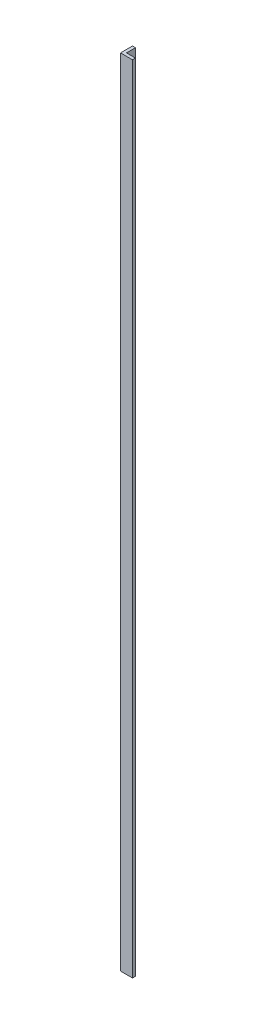
ISO-10303-21;
HEADER;
FILE_DESCRIPTION(('STEP AP214'),'2;1');
FILE_NAME('part.step','',(''),(''),'','','');
FILE_SCHEMA(('AUTOMOTIVE_DESIGN { 1 0 10303 214 1 1 1 1 }'));
ENDSEC;
DATA;
#1=APPLICATION_CONTEXT('core data for automotive mechanical design processes');
#2=APPLICATION_PROTOCOL_DEFINITION('international standard','automotive_design',2000,#1);
#3=PRODUCT_CONTEXT('',#1,'mechanical');
#4=PRODUCT('Part','Part','',(#3));
#5=PRODUCT_RELATED_PRODUCT_CATEGORY('part','',(#4));
#6=PRODUCT_DEFINITION_FORMATION('','',#4);
#7=PRODUCT_DEFINITION_CONTEXT('part definition',#1,'design');
#8=PRODUCT_DEFINITION('design','',#6,#7);
#9=PRODUCT_DEFINITION_SHAPE('','',#8);
#10=(LENGTH_UNIT() NAMED_UNIT(*) SI_UNIT(.MILLI.,.METRE.));
#11=(NAMED_UNIT(*) PLANE_ANGLE_UNIT() SI_UNIT($,.RADIAN.));
#12=(NAMED_UNIT(*) SI_UNIT($,.STERADIAN.) SOLID_ANGLE_UNIT());
#13=UNCERTAINTY_MEASURE_WITH_UNIT(LENGTH_MEASURE(1.E-05),#10,'distance_accuracy_value','');
#14=(GEOMETRIC_REPRESENTATION_CONTEXT(3) GLOBAL_UNCERTAINTY_ASSIGNED_CONTEXT((#13)) GLOBAL_UNIT_ASSIGNED_CONTEXT((#10,
#11,#12)) REPRESENTATION_CONTEXT('',''));
#15=CARTESIAN_POINT('',(0.,0.,0.));
#16=DIRECTION('',(0.,0.,1.));
#17=DIRECTION('',(1.,0.,0.));
#18=AXIS2_PLACEMENT_3D('',#15,#16,#17);
#19=CARTESIAN_POINT('',(0.,423.545,0.));
#20=DIRECTION('',(1.,0.,0.));
#21=DIRECTION('',(0.,0.,-1.));
#22=AXIS2_PLACEMENT_3D('',#19,#20,#21);
#23=PLANE('',#22);
#24=DIRECTION('',(0.,0.,1.));
#25=VECTOR('',#24,1.);
#26=CARTESIAN_POINT('',(0.,0.,0.));
#27=LINE('',#26,#25);
#28=CARTESIAN_POINT('',(0.,0.,-6.35));
#29=VERTEX_POINT('',#28);
#30=CARTESIAN_POINT('',(0.,0.,0.));
#31=VERTEX_POINT('',#30);
#32=EDGE_CURVE('E117',#29,#31,#27,.T.);
#33=ORIENTED_EDGE('',*,*,#32,.T.);
#34=DIRECTION('',(0.,-1.,0.));
#35=VECTOR('',#34,1.);
#36=CARTESIAN_POINT('',(0.,423.545,0.));
#37=LINE('',#36,#35);
#38=CARTESIAN_POINT('',(0.,423.545,0.));
#39=VERTEX_POINT('',#38);
#40=EDGE_CURVE('E11',#39,#31,#37,.T.);
#41=ORIENTED_EDGE('',*,*,#40,.F.);
#42=DIRECTION('',(0.,0.,1.));
#43=VECTOR('',#42,1.);
#44=CARTESIAN_POINT('',(0.,423.545,0.));
#45=LINE('',#44,#43);
#46=CARTESIAN_POINT('',(0.,423.545,-6.35));
#47=VERTEX_POINT('',#46);
#48=EDGE_CURVE('E127',#47,#39,#45,.T.);
#49=ORIENTED_EDGE('',*,*,#48,.F.);
#50=DIRECTION('',(0.,-1.,0.));
#51=VECTOR('',#50,1.);
#52=CARTESIAN_POINT('',(0.,423.545,-6.35));
#53=LINE('',#52,#51);
#54=EDGE_CURVE('E113',#47,#29,#53,.T.);
#55=ORIENTED_EDGE('',*,*,#54,.T.);
#56=EDGE_LOOP('',(#33,#41,#49,#55));
#57=FACE_BOUND('',#56,.T.);
#58=ADVANCED_FACE('F33',(#57),#23,.F.);
#59=CARTESIAN_POINT('',(0.,423.545,0.));
#60=DIRECTION('',(0.,0.,-1.));
#61=DIRECTION('',(-1.,0.,0.));
#62=AXIS2_PLACEMENT_3D('',#59,#60,#61);
#63=PLANE('',#62);
#64=DIRECTION('',(1.,0.,0.));
#65=VECTOR('',#64,1.);
#66=CARTESIAN_POINT('',(0.,0.,0.));
#67=LINE('',#66,#65);
#68=CARTESIAN_POINT('',(6.35,0.,0.));
#69=VERTEX_POINT('',#68);
#70=EDGE_CURVE('E120',#31,#69,#67,.T.);
#71=ORIENTED_EDGE('',*,*,#70,.T.);
#72=DIRECTION('',(0.,-1.,0.));
#73=VECTOR('',#72,1.);
#74=CARTESIAN_POINT('',(6.35,423.545,0.));
#75=LINE('',#74,#73);
#76=CARTESIAN_POINT('',(6.35,423.545,0.));
#77=VERTEX_POINT('',#76);
#78=EDGE_CURVE('E41',#77,#69,#75,.T.);
#79=ORIENTED_EDGE('',*,*,#78,.F.);
#80=DIRECTION('',(1.,0.,0.));
#81=VECTOR('',#80,1.);
#82=CARTESIAN_POINT('',(0.,423.545,0.));
#83=LINE('',#82,#81);
#84=EDGE_CURVE('E86',#39,#77,#83,.T.);
#85=ORIENTED_EDGE('',*,*,#84,.F.);
#86=ORIENTED_EDGE('',*,*,#40,.T.);
#87=EDGE_LOOP('',(#71,#79,#85,#86));
#88=FACE_BOUND('',#87,.T.);
#89=ADVANCED_FACE('F151',(#88),#63,.F.);
#90=CARTESIAN_POINT('',(6.35,423.545,0.));
#91=DIRECTION('',(-1.,0.,0.));
#92=DIRECTION('',(0.,0.,1.));
#93=AXIS2_PLACEMENT_3D('',#90,#91,#92);
#94=PLANE('',#93);
#95=DIRECTION('',(0.,0.,-1.));
#96=VECTOR('',#95,1.);
#97=CARTESIAN_POINT('',(6.35,0.,0.));
#98=LINE('',#97,#96);
#99=CARTESIAN_POINT('',(6.35,0.,-1.5875));
#100=VERTEX_POINT('',#99);
#101=EDGE_CURVE('E122',#69,#100,#98,.T.);
#102=ORIENTED_EDGE('',*,*,#101,.T.);
#103=DIRECTION('',(0.,-1.,0.));
#104=VECTOR('',#103,1.);
#105=CARTESIAN_POINT('',(6.35,423.545,-1.5875));
#106=LINE('',#105,#104);
#107=CARTESIAN_POINT('',(6.35,423.545,-1.5875));
#108=VERTEX_POINT('',#107);
#109=EDGE_CURVE('E108',#108,#100,#106,.T.);
#110=ORIENTED_EDGE('',*,*,#109,.F.);
#111=DIRECTION('',(0.,0.,-1.));
#112=VECTOR('',#111,1.);
#113=CARTESIAN_POINT('',(6.35,423.545,0.));
#114=LINE('',#113,#112);
#115=EDGE_CURVE('E99',#77,#108,#114,.T.);
#116=ORIENTED_EDGE('',*,*,#115,.F.);
#117=ORIENTED_EDGE('',*,*,#78,.T.);
#118=EDGE_LOOP('',(#102,#110,#116,#117));
#119=FACE_BOUND('',#118,.T.);
#120=ADVANCED_FACE('F133',(#119),#94,.F.);
#121=CARTESIAN_POINT('',(6.35,423.545,-1.5875));
#122=DIRECTION('',(0.,0.,1.));
#123=DIRECTION('',(1.,0.,0.));
#124=AXIS2_PLACEMENT_3D('',#121,#122,#123);
#125=PLANE('',#124);
#126=DIRECTION('',(-1.,0.,0.));
#127=VECTOR('',#126,1.);
#128=CARTESIAN_POINT('',(6.35,0.,-1.5875));
#129=LINE('',#128,#127);
#130=CARTESIAN_POINT('',(1.5875,0.,-1.5875));
#131=VERTEX_POINT('',#130);
#132=EDGE_CURVE('E107',#100,#131,#129,.T.);
#133=ORIENTED_EDGE('',*,*,#132,.T.);
#134=DIRECTION('',(0.,-1.,0.));
#135=VECTOR('',#134,1.);
#136=CARTESIAN_POINT('',(1.5875,423.545,-1.5875));
#137=LINE('',#136,#135);
#138=CARTESIAN_POINT('',(1.5875,423.545,-1.5875));
#139=VERTEX_POINT('',#138);
#140=EDGE_CURVE('E104',#139,#131,#137,.T.);
#141=ORIENTED_EDGE('',*,*,#140,.F.);
#142=DIRECTION('',(-1.,0.,0.));
#143=VECTOR('',#142,1.);
#144=CARTESIAN_POINT('',(6.35,423.545,-1.5875));
#145=LINE('',#144,#143);
#146=EDGE_CURVE('E93',#108,#139,#145,.T.);
#147=ORIENTED_EDGE('',*,*,#146,.F.);
#148=ORIENTED_EDGE('',*,*,#109,.T.);
#149=EDGE_LOOP('',(#133,#141,#147,#148));
#150=FACE_BOUND('',#149,.T.);
#151=ADVANCED_FACE('F105',(#150),#125,.F.);
#152=CARTESIAN_POINT('',(1.5875,423.545,-6.35));
#153=DIRECTION('',(-1.,0.,0.));
#154=DIRECTION('',(0.,0.,1.));
#155=AXIS2_PLACEMENT_3D('',#152,#153,#154);
#156=PLANE('',#155);
#157=DIRECTION('',(0.,0.,-1.));
#158=VECTOR('',#157,1.);
#159=CARTESIAN_POINT('',(1.5875,0.,-6.35));
#160=LINE('',#159,#158);
#161=CARTESIAN_POINT('',(1.5875,0.,-6.35));
#162=VERTEX_POINT('',#161);
#163=EDGE_CURVE('E72',#131,#162,#160,.T.);
#164=ORIENTED_EDGE('',*,*,#163,.T.);
#165=DIRECTION('',(0.,-1.,0.));
#166=VECTOR('',#165,1.);
#167=CARTESIAN_POINT('',(1.5875,423.545,-6.35));
#168=LINE('',#167,#166);
#169=CARTESIAN_POINT('',(1.5875,423.545,-6.35));
#170=VERTEX_POINT('',#169);
#171=EDGE_CURVE('E109',#170,#162,#168,.T.);
#172=ORIENTED_EDGE('',*,*,#171,.F.);
#173=DIRECTION('',(0.,0.,-1.));
#174=VECTOR('',#173,1.);
#175=CARTESIAN_POINT('',(1.5875,423.545,-6.35));
#176=LINE('',#175,#174);
#177=EDGE_CURVE('E97',#139,#170,#176,.T.);
#178=ORIENTED_EDGE('',*,*,#177,.F.);
#179=ORIENTED_EDGE('',*,*,#140,.T.);
#180=EDGE_LOOP('',(#164,#172,#178,#179));
#181=FACE_BOUND('',#180,.T.);
#182=ADVANCED_FACE('F111',(#181),#156,.F.);
#183=CARTESIAN_POINT('',(0.,423.545,-6.35));
#184=DIRECTION('',(0.,0.,1.));
#185=DIRECTION('',(1.,0.,0.));
#186=AXIS2_PLACEMENT_3D('',#183,#184,#185);
#187=PLANE('',#186);
#188=DIRECTION('',(-1.,0.,0.));
#189=VECTOR('',#188,1.);
#190=CARTESIAN_POINT('',(0.,0.,-6.35));
#191=LINE('',#190,#189);
#192=EDGE_CURVE('E78',#162,#29,#191,.T.);
#193=ORIENTED_EDGE('',*,*,#192,.T.);
#194=ORIENTED_EDGE('',*,*,#54,.F.);
#195=DIRECTION('',(-1.,0.,0.));
#196=VECTOR('',#195,1.);
#197=CARTESIAN_POINT('',(0.,423.545,-6.35));
#198=LINE('',#197,#196);
#199=EDGE_CURVE('E49',#170,#47,#198,.T.);
#200=ORIENTED_EDGE('',*,*,#199,.F.);
#201=ORIENTED_EDGE('',*,*,#171,.T.);
#202=EDGE_LOOP('',(#193,#194,#200,#201));
#203=FACE_BOUND('',#202,.T.);
#204=ADVANCED_FACE('F140',(#203),#187,.F.);
#205=CARTESIAN_POINT('',(0.,423.545,0.));
#206=DIRECTION('',(0.,-1.,0.));
#207=DIRECTION('',(0.,0.,-1.));
#208=AXIS2_PLACEMENT_3D('',#205,#206,#207);
#209=PLANE('',#208);
#210=ORIENTED_EDGE('',*,*,#48,.T.);
#211=ORIENTED_EDGE('',*,*,#84,.T.);
#212=ORIENTED_EDGE('',*,*,#115,.T.);
#213=ORIENTED_EDGE('',*,*,#146,.T.);
#214=ORIENTED_EDGE('',*,*,#177,.T.);
#215=ORIENTED_EDGE('',*,*,#199,.T.);
#216=EDGE_LOOP('',(#210,#211,#212,#213,#214,#215));
#217=FACE_BOUND('',#216,.T.);
#218=ADVANCED_FACE('F95',(#217),#209,.F.);
#219=CARTESIAN_POINT('',(0.,0.,0.));
#220=DIRECTION('',(0.,-1.,0.));
#221=DIRECTION('',(0.,0.,-1.));
#222=AXIS2_PLACEMENT_3D('',#219,#220,#221);
#223=PLANE('',#222);
#224=ORIENTED_EDGE('',*,*,#32,.F.);
#225=ORIENTED_EDGE('',*,*,#192,.F.);
#226=ORIENTED_EDGE('',*,*,#163,.F.);
#227=ORIENTED_EDGE('',*,*,#132,.F.);
#228=ORIENTED_EDGE('',*,*,#101,.F.);
#229=ORIENTED_EDGE('',*,*,#70,.F.);
#230=EDGE_LOOP('',(#224,#225,#226,#227,#228,#229));
#231=FACE_BOUND('',#230,.T.);
#232=ADVANCED_FACE('F136',(#231),#223,.T.);
#233=CLOSED_SHELL('',(#58,#89,#120,#151,#182,#204,#218,#232));
#234=MANIFOLD_SOLID_BREP('B2',#233);
#235=ADVANCED_BREP_SHAPE_REPRESENTATION('',(#18,#234),#14);
#236=SHAPE_DEFINITION_REPRESENTATION(#9,#235);
ENDSEC;
END-ISO-10303-21;
